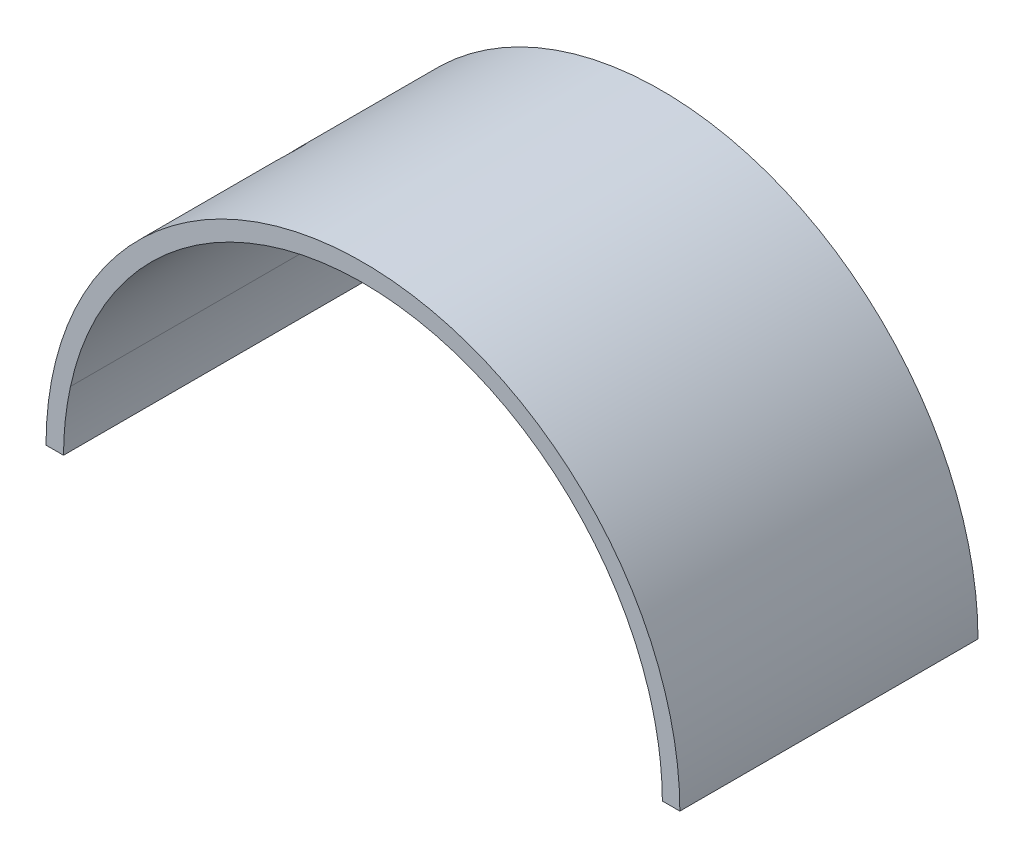
ISO-10303-21;
HEADER;
FILE_DESCRIPTION(('STEP AP214'),'2;1');
FILE_NAME('part.step','',(''),(''),'','','');
FILE_SCHEMA(('AUTOMOTIVE_DESIGN { 1 0 10303 214 1 1 1 1 }'));
ENDSEC;
DATA;
#1=APPLICATION_CONTEXT('core data for automotive mechanical design processes');
#2=APPLICATION_PROTOCOL_DEFINITION('international standard','automotive_design',2000,#1);
#3=PRODUCT_CONTEXT('',#1,'mechanical');
#4=PRODUCT('Part','Part','',(#3));
#5=PRODUCT_RELATED_PRODUCT_CATEGORY('part','',(#4));
#6=PRODUCT_DEFINITION_FORMATION('','',#4);
#7=PRODUCT_DEFINITION_CONTEXT('part definition',#1,'design');
#8=PRODUCT_DEFINITION('design','',#6,#7);
#9=PRODUCT_DEFINITION_SHAPE('','',#8);
#10=(LENGTH_UNIT() NAMED_UNIT(*) SI_UNIT(.MILLI.,.METRE.));
#11=(NAMED_UNIT(*) PLANE_ANGLE_UNIT() SI_UNIT($,.RADIAN.));
#12=(NAMED_UNIT(*) SI_UNIT($,.STERADIAN.) SOLID_ANGLE_UNIT());
#13=UNCERTAINTY_MEASURE_WITH_UNIT(LENGTH_MEASURE(1.E-05),#10,'distance_accuracy_value','');
#14=(GEOMETRIC_REPRESENTATION_CONTEXT(3) GLOBAL_UNCERTAINTY_ASSIGNED_CONTEXT((#13)) GLOBAL_UNIT_ASSIGNED_CONTEXT((#10,
#11,#12)) REPRESENTATION_CONTEXT('',''));
#15=CARTESIAN_POINT('',(0.,0.,0.));
#16=DIRECTION('',(0.,0.,1.));
#17=DIRECTION('',(1.,0.,0.));
#18=AXIS2_PLACEMENT_3D('',#15,#16,#17);
#19=CARTESIAN_POINT('',(0.,0.,15.));
#20=DIRECTION('',(0.,0.,-1.));
#21=DIRECTION('',(-1.,0.,0.));
#22=AXIS2_PLACEMENT_3D('',#19,#20,#21);
#23=CYLINDRICAL_SURFACE('',#22,31.891178343949);
#24=CARTESIAN_POINT('',(-23.5861707782628,21.4648504347034,0.));
#25=CARTESIAN_POINT('',(-23.5861684844341,21.4648533996071,-0.0842056450766564));
#26=CARTESIAN_POINT('',(-23.5813787582294,21.4701196999326,-0.168471160939301));
#27=CARTESIAN_POINT('',(-23.5623197278144,21.4910338898944,-0.334678044970872));
#28=CARTESIAN_POINT('',(-23.5480392265585,21.5066940419807,-0.416616548567354));
#29=CARTESIAN_POINT('',(-23.5103496231131,21.5478883336469,-0.57573765441283));
#30=CARTESIAN_POINT('',(-23.4869451406602,21.5734174762157,-0.652922640639572));
#31=CARTESIAN_POINT('',(-23.4315894525111,21.6335279874064,-0.800367786812534));
#32=CARTESIAN_POINT('',(-23.3996402765991,21.6681072061494,-0.870629585938251));
#33=CARTESIAN_POINT('',(-23.3279586868115,21.7452607784415,-1.00231902878046));
#34=CARTESIAN_POINT('',(-23.288220098308,21.7878414736063,-1.06373959666824));
#35=CARTESIAN_POINT('',(-23.2019794991747,21.8796563486256,-1.1759428236805));
#36=CARTESIAN_POINT('',(-23.1554772138223,21.9288907987314,-1.22672505050055));
#37=CARTESIAN_POINT('',(-23.0568892622577,22.0325264820708,-1.31622871656887));
#38=CARTESIAN_POINT('',(-23.0048011176285,22.086930007566,-1.35494477211088));
#39=CARTESIAN_POINT('',(-22.8964384243817,22.1992442816038,-1.41918249867796));
#40=CARTESIAN_POINT('',(-22.8401639047671,22.2571550058482,-1.44470426110272));
#41=CARTESIAN_POINT('',(-22.7250015758546,22.3747250732506,-1.48181059169306));
#42=CARTESIAN_POINT('',(-22.6661157505129,22.434383077585,-1.49340555890213));
#43=CARTESIAN_POINT('',(-22.5473331559386,22.5537605009847,-1.50236124687815));
#44=CARTESIAN_POINT('',(-22.48743639396,22.6134799196064,-1.49972206973864));
#45=CARTESIAN_POINT('',(-22.3683897133732,22.7312429143901,-1.4802930308368));
#46=CARTESIAN_POINT('',(-22.3092392414373,22.7892877789017,-1.46351436502192));
#47=CARTESIAN_POINT('',(-22.1933607715533,22.9021514274409,-1.41629998423326));
#48=CARTESIAN_POINT('',(-22.1366327829011,22.9569701990895,-1.38586421685857));
#49=CARTESIAN_POINT('',(-22.0272638892622,23.0619308677445,-1.31218681102004));
#50=CARTESIAN_POINT('',(-21.9746246246733,23.1120708892421,-1.26894006594031));
#51=CARTESIAN_POINT('',(-21.8750519089046,23.2063368183472,-1.17087205699757));
#52=CARTESIAN_POINT('',(-21.828118493124,23.2504626886432,-1.11605072133144));
#53=CARTESIAN_POINT('',(-21.741360230017,23.3316105635845,-0.996326401297222));
#54=CARTESIAN_POINT('',(-21.701542311647,23.3686256464621,-0.931413703879964));
#55=CARTESIAN_POINT('',(-21.6303182494101,23.4345674602743,-0.793383437425425));
#56=CARTESIAN_POINT('',(-21.5989121075929,23.4634941892381,-0.720265866388825));
#57=CARTESIAN_POINT('',(-21.5455084446403,23.5125422535556,-0.567895549585973));
#58=CARTESIAN_POINT('',(-21.5235111859085,23.5326633433298,-0.488642632784224));
#59=CARTESIAN_POINT('',(-21.4896337894364,23.5636038548522,-0.326253959852264));
#60=CARTESIAN_POINT('',(-21.4777535843533,23.5744233385153,-0.243118229571348));
#61=CARTESIAN_POINT('',(-21.4645013365074,23.5864902125467,-0.0754091434874953));
#62=CARTESIAN_POINT('',(-21.4631192367628,23.5877467640216,0.00916275860891193));
#63=CARTESIAN_POINT('',(-21.470881490352,23.5806813021931,0.17741847020004));
#64=CARTESIAN_POINT('',(-21.4800258129493,23.5723593168588,0.26110228228722));
#65=CARTESIAN_POINT('',(-21.5085382887741,23.5463458981393,0.425168213638861));
#66=CARTESIAN_POINT('',(-21.5279018578722,23.5286586657864,0.505551795902393));
#67=CARTESIAN_POINT('',(-21.576227877518,23.4843504319728,0.660780517473767));
#68=CARTESIAN_POINT('',(-21.6051903771289,23.4577293848486,0.735625628470407));
#69=CARTESIAN_POINT('',(-21.6718191682856,23.3961868811122,0.877715364740085));
#70=CARTESIAN_POINT('',(-21.7094920705777,23.3612591195535,0.944954159195234));
#71=CARTESIAN_POINT('',(-21.792346545008,23.2839878165644,1.06986396292068));
#72=CARTESIAN_POINT('',(-21.8375281599497,23.24164423286,1.12753491764585));
#73=CARTESIAN_POINT('',(-21.934040418867,23.1505836593391,1.23171758809203));
#74=CARTESIAN_POINT('',(-21.9853758507697,23.1018617041329,1.27822052903582));
#75=CARTESIAN_POINT('',(-22.0926023872006,22.9993406567356,1.3586871436488));
#76=CARTESIAN_POINT('',(-22.148493473608,22.9455415847394,1.39265086719175));
#77=CARTESIAN_POINT('',(-22.2631330170617,22.83432797734,1.44705958460348));
#78=CARTESIAN_POINT('',(-22.3218802740224,22.7769149574821,1.46751020450268));
#79=CARTESIAN_POINT('',(-22.4405279602972,22.6600285326636,1.4943306241586));
#80=CARTESIAN_POINT('',(-22.5004283840926,22.6005551375623,1.5007004912835));
#81=CARTESIAN_POINT('',(-22.6196024256204,22.4812798339522,1.49917793050085));
#82=CARTESIAN_POINT('',(-22.6788765929662,22.4214782982985,1.49129927444848));
#83=CARTESIAN_POINT('',(-22.7951963204169,22.3032097087843,1.46153176221857));
#84=CARTESIAN_POINT('',(-22.852241876277,22.2447426574657,1.43964287935749));
#85=CARTESIAN_POINT('',(-22.9625470713407,22.1308603057349,1.38247899099652));
#86=CARTESIAN_POINT('',(-23.0158066742463,22.0754450345829,1.3472038571758));
#87=CARTESIAN_POINT('',(-23.1171214033634,21.9693273186902,1.26427136489092));
#88=CARTESIAN_POINT('',(-23.1651766943647,21.9186247247342,1.21661439864857));
#89=CARTESIAN_POINT('',(-23.2548770356784,21.8234332558814,1.11022237879009));
#90=CARTESIAN_POINT('',(-23.2965165530456,21.7789497473346,1.05147785935329));
#91=CARTESIAN_POINT('',(-23.3722866367452,21.6976167396833,0.924581961757363));
#92=CARTESIAN_POINT('',(-23.4064153509822,21.6607691236505,0.856428270109561));
#93=CARTESIAN_POINT('',(-23.4663236643244,21.5958530500546,0.712599934019658));
#94=CARTESIAN_POINT('',(-23.4920956951955,21.5677925513314,0.636918552714936));
#95=CARTESIAN_POINT('',(-23.5345880480082,21.5214177084887,0.480288371734971));
#96=CARTESIAN_POINT('',(-23.5513190802707,21.5030918327928,0.39934593248389));
#97=CARTESIAN_POINT('',(-23.5709269704012,21.4815915520604,0.264915879462323));
#98=CARTESIAN_POINT('',(-23.5766369964807,21.4753225045649,0.212299340822071));
#99=CARTESIAN_POINT('',(-23.5842596241817,21.4669510100934,0.106463180096453));
#100=CARTESIAN_POINT('',(-23.5861722286597,21.4648485599832,0.0532435584647787));
#101=CARTESIAN_POINT('',(-23.5861707782628,21.4648504347034,0.));
#102=B_SPLINE_CURVE_WITH_KNOTS('',3,(#24,#25,#26,#27,#28,#29,#30,#31,#32,#33,#34,#35,#36,#37,
#38,#39,#40,#41,#42,#43,#44,#45,#46,#47,#48,#49,#50,#51,#52,#53,#54,#55,#56,#57,#58,#59,#60,#61,
#62,#63,#64,#65,#66,#67,#68,#69,#70,#71,#72,#73,#74,#75,#76,#77,#78,#79,#80,#81,#82,#83,#84,#85,
#86,#87,#88,#89,#90,#91,#92,#93,#94,#95,#96,#97,#98,#99,#100,#101),.UNSPECIFIED.,.T.,.F.,(4,2,2,
2,2,2,2,2,2,2,2,2,2,2,2,2,2,2,2,2,2,2,2,2,2,2,2,2,2,2,2,2,2,2,2,2,2,2,4),(0.,0.252422578213682,
0.505143489953849,0.757736607609463,1.01026977521504,1.26300394008331,1.51574837317983,
1.76860541533365,2.02146070586911,2.27412707346566,2.52679162883007,2.77925630681321,
3.03172195348573,3.2842883718505,3.5368563570604,3.78966896434948,4.04248163324273,
4.29530135235347,4.54811938859166,4.8006951994567,5.05327027281446,5.30573214272693,
5.55819530306864,5.8108507025436,6.06350754232774,6.31636225139883,6.56921595474898,
6.82196431882982,7.07471147365476,7.32721446723857,7.57971794173497,7.83222383679539,
8.08472173415094,8.33743618067422,8.59021287462015,8.84321786061515,9.09592246625197,
9.25553036900808,9.41513815170146),.UNSPECIFIED.);
#103=CARTESIAN_POINT('',(-23.5861707782628,21.4648504347034,0.));
#104=VERTEX_POINT('',#103);
#105=EDGE_CURVE('E172',#104,#104,#102,.T.);
#106=ORIENTED_EDGE('',*,*,#105,.T.);
#107=EDGE_LOOP('',(#106));
#108=FACE_BOUND('',#107,.T.);
#109=CARTESIAN_POINT('',(0.,0.,-15.));
#110=DIRECTION('',(0.,0.,1.));
#111=DIRECTION('',(-1.,0.,0.));
#112=AXIS2_PLACEMENT_3D('',#109,#110,#111);
#113=CIRCLE('',#112,31.891178343949);
#114=CARTESIAN_POINT('',(31.891178343949,0.,-15.));
#115=VERTEX_POINT('',#114);
#116=CARTESIAN_POINT('',(-31.891178343949,0.,-15.));
#117=VERTEX_POINT('',#116);
#118=EDGE_CURVE('E141',#115,#117,#113,.T.);
#119=ORIENTED_EDGE('',*,*,#118,.T.);
#120=DIRECTION('',(0.,0.,-1.));
#121=VECTOR('',#120,1.);
#122=CARTESIAN_POINT('',(-31.891178343949,0.,15.));
#123=LINE('',#122,#121);
#124=CARTESIAN_POINT('',(-31.891178343949,0.,15.));
#125=VERTEX_POINT('',#124);
#126=EDGE_CURVE('E11',#125,#117,#123,.T.);
#127=ORIENTED_EDGE('',*,*,#126,.F.);
#128=CARTESIAN_POINT('',(0.,0.,15.));
#129=DIRECTION('',(0.,0.,1.));
#130=DIRECTION('',(-1.,0.,0.));
#131=AXIS2_PLACEMENT_3D('',#128,#129,#130);
#132=CIRCLE('',#131,31.891178343949);
#133=CARTESIAN_POINT('',(31.891178343949,0.,15.));
#134=VERTEX_POINT('',#133);
#135=EDGE_CURVE('E147',#134,#125,#132,.T.);
#136=ORIENTED_EDGE('',*,*,#135,.F.);
#137=DIRECTION('',(0.,0.,-1.));
#138=VECTOR('',#137,1.);
#139=CARTESIAN_POINT('',(31.891178343949,0.,15.));
#140=LINE('',#139,#138);
#141=EDGE_CURVE('E63',#134,#115,#140,.T.);
#142=ORIENTED_EDGE('',*,*,#141,.T.);
#143=EDGE_LOOP('',(#119,#127,#136,#142));
#144=FACE_BOUND('',#143,.T.);
#145=ADVANCED_FACE('F47',(#108,#144),#23,.T.);
#146=CARTESIAN_POINT('',(-31.891178343949,0.,15.));
#147=DIRECTION('',(0.,1.,0.));
#148=DIRECTION('',(0.,0.,1.));
#149=AXIS2_PLACEMENT_3D('',#146,#147,#148);
#150=PLANE('',#149);
#151=DIRECTION('',(1.,0.,0.));
#152=VECTOR('',#151,1.);
#153=CARTESIAN_POINT('',(-31.891178343949,0.,-15.));
#154=LINE('',#153,#152);
#155=CARTESIAN_POINT('',(-30.129278343949,0.,-15.));
#156=VERTEX_POINT('',#155);
#157=EDGE_CURVE('E83',#117,#156,#154,.T.);
#158=ORIENTED_EDGE('',*,*,#157,.T.);
#159=DIRECTION('',(0.,0.,-1.));
#160=VECTOR('',#159,1.);
#161=CARTESIAN_POINT('',(-30.129278343949,0.,15.));
#162=LINE('',#161,#160);
#163=CARTESIAN_POINT('',(-30.129278343949,0.,15.));
#164=VERTEX_POINT('',#163);
#165=EDGE_CURVE('E137',#164,#156,#162,.T.);
#166=ORIENTED_EDGE('',*,*,#165,.F.);
#167=DIRECTION('',(1.,0.,0.));
#168=VECTOR('',#167,1.);
#169=CARTESIAN_POINT('',(-31.891178343949,0.,15.));
#170=LINE('',#169,#168);
#171=EDGE_CURVE('E124',#125,#164,#170,.T.);
#172=ORIENTED_EDGE('',*,*,#171,.F.);
#173=ORIENTED_EDGE('',*,*,#126,.T.);
#174=EDGE_LOOP('',(#158,#166,#172,#173));
#175=FACE_BOUND('',#174,.T.);
#176=ADVANCED_FACE('F199',(#175),#150,.F.);
#177=CARTESIAN_POINT('',(30.472178343949,0.,15.));
#178=DIRECTION('',(0.,1.,0.));
#179=DIRECTION('',(0.,0.,1.));
#180=AXIS2_PLACEMENT_3D('',#177,#178,#179);
#181=PLANE('',#180);
#182=DIRECTION('',(1.,0.,0.));
#183=VECTOR('',#182,1.);
#184=CARTESIAN_POINT('',(30.472178343949,0.,-15.));
#185=LINE('',#184,#183);
#186=CARTESIAN_POINT('',(30.129278343949,0.,-15.));
#187=VERTEX_POINT('',#186);
#188=EDGE_CURVE('E150',#187,#115,#185,.T.);
#189=ORIENTED_EDGE('',*,*,#188,.T.);
#190=ORIENTED_EDGE('',*,*,#141,.F.);
#191=DIRECTION('',(1.,0.,0.));
#192=VECTOR('',#191,1.);
#193=CARTESIAN_POINT('',(30.472178343949,0.,15.));
#194=LINE('',#193,#192);
#195=CARTESIAN_POINT('',(30.129278343949,0.,15.));
#196=VERTEX_POINT('',#195);
#197=EDGE_CURVE('E71',#196,#134,#194,.T.);
#198=ORIENTED_EDGE('',*,*,#197,.F.);
#199=DIRECTION('',(0.,0.,-1.));
#200=VECTOR('',#199,1.);
#201=CARTESIAN_POINT('',(30.129278343949,0.,15.));
#202=LINE('',#201,#200);
#203=EDGE_CURVE('E120',#196,#187,#202,.T.);
#204=ORIENTED_EDGE('',*,*,#203,.T.);
#205=EDGE_LOOP('',(#189,#190,#198,#204));
#206=FACE_BOUND('',#205,.T.);
#207=ADVANCED_FACE('F119',(#206),#181,.F.);
#208=CARTESIAN_POINT('',(0.,0.,15.));
#209=DIRECTION('',(0.,0.,-1.));
#210=DIRECTION('',(-1.,0.,0.));
#211=AXIS2_PLACEMENT_3D('',#208,#209,#210);
#212=PLANE('',#211);
#213=ORIENTED_EDGE('',*,*,#135,.T.);
#214=ORIENTED_EDGE('',*,*,#171,.T.);
#215=CARTESIAN_POINT('',(0.,-0.116742127165869,15.));
#216=DIRECTION('',(0.,0.,-1.));
#217=DIRECTION('',(-1.,0.,0.));
#218=AXIS2_PLACEMENT_3D('',#215,#216,#217);
#219=CIRCLE('',#218,30.1295045138716);
#220=CARTESIAN_POINT('',(-29.4273391340799,6.35,15.));
#221=VERTEX_POINT('',#220);
#222=EDGE_CURVE('E91',#164,#221,#219,.T.);
#223=ORIENTED_EDGE('',*,*,#222,.T.);
#224=CARTESIAN_POINT('',(0.,0.,15.));
#225=DIRECTION('',(0.,0.,-1.));
#226=DIRECTION('',(1.,0.,0.));
#227=AXIS2_PLACEMENT_3D('',#224,#225,#226);
#228=ELLIPSE('',#227,30.1052922759765,30.091178343949);
#229=CARTESIAN_POINT('',(29.4273391340799,6.35,15.));
#230=VERTEX_POINT('',#229);
#231=EDGE_CURVE('E128',#221,#230,#228,.T.);
#232=ORIENTED_EDGE('',*,*,#231,.T.);
#233=CARTESIAN_POINT('',(0.,-0.116742127165869,15.));
#234=DIRECTION('',(0.,0.,-1.));
#235=DIRECTION('',(-1.,0.,0.));
#236=AXIS2_PLACEMENT_3D('',#233,#234,#235);
#237=CIRCLE('',#236,30.1295045138716);
#238=EDGE_CURVE('E116',#230,#196,#237,.T.);
#239=ORIENTED_EDGE('',*,*,#238,.T.);
#240=ORIENTED_EDGE('',*,*,#197,.T.);
#241=EDGE_LOOP('',(#213,#214,#223,#232,#239,#240));
#242=FACE_BOUND('',#241,.T.);
#243=ADVANCED_FACE('F126',(#242),#212,.F.);
#244=CARTESIAN_POINT('',(0.,0.,-15.));
#245=DIRECTION('',(0.,0.,-1.));
#246=DIRECTION('',(-1.,0.,0.));
#247=AXIS2_PLACEMENT_3D('',#244,#245,#246);
#248=PLANE('',#247);
#249=ORIENTED_EDGE('',*,*,#118,.F.);
#250=ORIENTED_EDGE('',*,*,#188,.F.);
#251=CARTESIAN_POINT('',(0.,-0.116742127165869,-15.));
#252=DIRECTION('',(0.,0.,-1.));
#253=DIRECTION('',(-1.,0.,0.));
#254=AXIS2_PLACEMENT_3D('',#251,#252,#253);
#255=CIRCLE('',#254,30.1295045138716);
#256=CARTESIAN_POINT('',(29.4273391340799,6.35,-15.));
#257=VERTEX_POINT('',#256);
#258=EDGE_CURVE('E134',#257,#187,#255,.T.);
#259=ORIENTED_EDGE('',*,*,#258,.F.);
#260=CARTESIAN_POINT('',(0.,0.,-15.));
#261=DIRECTION('',(0.,0.,-1.));
#262=DIRECTION('',(1.,0.,0.));
#263=AXIS2_PLACEMENT_3D('',#260,#261,#262);
#264=ELLIPSE('',#263,30.1052922759765,30.091178343949);
#265=CARTESIAN_POINT('',(-29.4273391340799,6.35,-15.));
#266=VERTEX_POINT('',#265);
#267=EDGE_CURVE('E166',#266,#257,#264,.T.);
#268=ORIENTED_EDGE('',*,*,#267,.F.);
#269=CARTESIAN_POINT('',(0.,-0.116742127165869,-15.));
#270=DIRECTION('',(0.,0.,-1.));
#271=DIRECTION('',(-1.,0.,0.));
#272=AXIS2_PLACEMENT_3D('',#269,#270,#271);
#273=CIRCLE('',#272,30.1295045138716);
#274=EDGE_CURVE('E109',#156,#266,#273,.T.);
#275=ORIENTED_EDGE('',*,*,#274,.F.);
#276=ORIENTED_EDGE('',*,*,#157,.F.);
#277=EDGE_LOOP('',(#249,#250,#259,#268,#275,#276));
#278=FACE_BOUND('',#277,.T.);
#279=ADVANCED_FACE('F163',(#278),#248,.T.);
#280=DIRECTION('',(0.,0.,-1.));
#281=VECTOR('',#280,1.);
#282=SURFACE_OF_LINEAR_EXTRUSION('',#228,#281);
#283=CARTESIAN_POINT('',(-22.3173756934258,20.1960553498664,0.));
#284=CARTESIAN_POINT('',(-22.3173720699418,20.1960598988503,0.0842118870157788));
#285=CARTESIAN_POINT('',(-22.3125885295493,20.2013446421752,0.16851012024988));
#286=CARTESIAN_POINT('',(-22.2983425726377,20.2170490014014,0.293078415454844));
#287=CARTESIAN_POINT('',(-22.2924077724488,20.223588481611,0.334320760957655));
#288=CARTESIAN_POINT('',(-22.2782108787267,20.2392120671441,0.415955999808417));
#289=CARTESIAN_POINT('',(-22.2699467377907,20.2482984110258,0.456348112116058));
#290=CARTESIAN_POINT('',(-22.2417544986396,20.2792479485778,0.575646484153211));
#291=CARTESIAN_POINT('',(-22.2184075535403,20.3048227593725,0.652840638303673));
#292=CARTESIAN_POINT('',(-22.1631610892486,20.3650540056566,0.800318576057142));
#293=CARTESIAN_POINT('',(-22.1312613414147,20.3997106839304,0.870602174852092));
#294=CARTESIAN_POINT('',(-22.0776151317216,20.4576522151797,0.969352859419526));
#295=CARTESIAN_POINT('',(-22.0587440879092,20.4779833048965,1.00118721594349));
#296=CARTESIAN_POINT('',(-22.0192029581346,20.5204546897901,1.06238056876157));
#297=CARTESIAN_POINT('',(-21.9985346195137,20.5425932265029,1.09174191583743));
#298=CARTESIAN_POINT('',(-21.9339761128854,20.6115172796569,1.17585770206296));
#299=CARTESIAN_POINT('',(-21.8875191834862,20.6608256199224,1.22666830756315));
#300=CARTESIAN_POINT('',(-21.789025140384,20.7645746710846,1.31619922390322));
#301=CARTESIAN_POINT('',(-21.7369853439132,20.8190178479219,1.35491368683736));
#302=CARTESIAN_POINT('',(-21.62869047376,20.9313966281349,1.41915649958636));
#303=CARTESIAN_POINT('',(-21.5724354320795,20.9893322049958,1.44468494949702));
#304=CARTESIAN_POINT('',(-21.4572912533229,21.1069189508684,1.48179958323733));
#305=CARTESIAN_POINT('',(-21.3984043738336,21.1665686344131,1.49339748731581));
#306=CARTESIAN_POINT('',(-21.2795904348727,21.2859017243343,1.50236107459207));
#307=CARTESIAN_POINT('',(-21.2196633834559,21.3455851304462,1.49972686794961));
#308=CARTESIAN_POINT('',(-21.1005337915442,21.4632443632428,1.48030991597405));
#309=CARTESIAN_POINT('',(-21.0413306652442,21.5212216325176,1.46353950101837));
#310=CARTESIAN_POINT('',(-20.9253234522278,21.6339284608625,1.41634568030843));
#311=CARTESIAN_POINT('',(-20.8685193758838,21.6886580058911,1.3859222155303));
#312=CARTESIAN_POINT('',(-20.7589772918816,21.7934300453406,1.31227077271103));
#313=CARTESIAN_POINT('',(-20.7062412018965,21.8434703315759,1.26903680165181));
#314=CARTESIAN_POINT('',(-20.6064663692459,21.9375321525425,1.17099600781837));
#315=CARTESIAN_POINT('',(-20.5594276669006,21.9815536446793,1.11618910315057));
#316=CARTESIAN_POINT('',(-20.4724541161481,22.0625036777707,0.996486751836818));
#317=CARTESIAN_POINT('',(-20.4325270860122,22.0994244159694,0.931580347258977));
#318=CARTESIAN_POINT('',(-20.3610974229768,22.1651916111584,0.793559919648567));
#319=CARTESIAN_POINT('',(-20.3295947915238,22.1940380667622,0.720445895206602));
#320=CARTESIAN_POINT('',(-20.2760203499443,22.2429477165631,0.56808020168031));
#321=CARTESIAN_POINT('',(-20.2539486985494,22.2630107629279,0.488828429318919));
#322=CARTESIAN_POINT('',(-20.2199516399826,22.2938637558685,0.326438963412227));
#323=CARTESIAN_POINT('',(-20.2080261554243,22.304653773171,0.243301299510307));
#324=CARTESIAN_POINT('',(-20.1947178228173,22.3166926853974,0.0755976891646732));
#325=CARTESIAN_POINT('',(-20.1933234228143,22.3179520348828,-0.00896659024621945));
#326=CARTESIAN_POINT('',(-20.2010923396587,22.3109267902174,-0.177208826028274));
#327=CARTESIAN_POINT('',(-20.2102556212013,22.3026422279814,-0.260886785362342));
#328=CARTESIAN_POINT('',(-20.2388335001911,22.276736217601,-0.424937573355346));
#329=CARTESIAN_POINT('',(-20.2582428521298,22.2591195470433,-0.505312070558634));
#330=CARTESIAN_POINT('',(-20.3066817741522,22.2149794368159,-0.660525791681849));
#331=CARTESIAN_POINT('',(-20.3357114003644,22.1884559451802,-0.735364983303507));
#332=CARTESIAN_POINT('',(-20.4024916871832,22.1271237752897,-0.877454975172304));
#333=CARTESIAN_POINT('',(-20.4402498954967,22.0923079257416,-0.944699132558702));
#334=CARTESIAN_POINT('',(-20.5232814720315,22.0152668464,-1.06962346696603));
#335=CARTESIAN_POINT('',(-20.568554889056,21.9730415684902,-1.12730358187414));
#336=CARTESIAN_POINT('',(-20.6652540168951,21.8822076411448,-1.23151505734047));
#337=CARTESIAN_POINT('',(-20.7166852379657,21.8335932706299,-1.27803631901681));
#338=CARTESIAN_POINT('',(-20.8240932763874,21.7312712383962,-1.35854061767316));
#339=CARTESIAN_POINT('',(-20.8800700743283,21.6775635984259,-1.39252370818897));
#340=CARTESIAN_POINT('',(-20.9948611796159,21.5665106887715,-1.446969852099));
#341=CARTESIAN_POINT('',(-21.0536741785873,21.5091670926279,-1.46743907678539));
#342=CARTESIAN_POINT('',(-21.1724295318662,21.392390916188,-1.49429702648369));
#343=CARTESIAN_POINT('',(-21.2323718797787,21.3329583477189,-1.50068583120206));
#344=CARTESIAN_POINT('',(-21.3515976117058,21.2137396173807,-1.49919840463336));
#345=CARTESIAN_POINT('',(-21.4108816457872,21.1539539143001,-1.49133779599439));
#346=CARTESIAN_POINT('',(-21.5271893353718,21.035694271918,-1.46161524461105));
#347=CARTESIAN_POINT('',(-21.5842129868881,20.9772203349302,-1.43975327717201));
#348=CARTESIAN_POINT('',(-21.6944769684534,20.8632729536093,-1.38262075439723));
#349=CARTESIAN_POINT('',(-21.7477173530384,20.8077994660271,-1.34735039239101));
#350=CARTESIAN_POINT('',(-21.8236049357587,20.7281716961824,-1.2852208348143));
#351=CARTESIAN_POINT('',(-21.848242880976,20.7022216502845,-1.26296860511254));
#352=CARTESIAN_POINT('',(-21.8960845858954,20.6516618751931,-1.21551659401488));
#353=CARTESIAN_POINT('',(-21.9192869434207,20.6270534591077,-1.1903139982769));
#354=CARTESIAN_POINT('',(-21.986488444154,20.5555531014322,-1.11054260183842));
#355=CARTESIAN_POINT('',(-22.0280959550328,20.5109713895092,-1.05179874129597));
#356=CARTESIAN_POINT('',(-22.1037802685721,20.4294645416136,-0.924904177645624));
#357=CARTESIAN_POINT('',(-22.1378572107601,20.3925392637823,-0.856753648863943));
#358=CARTESIAN_POINT('',(-22.1827061846352,20.3437539737468,-0.748943190795513));
#359=CARTESIAN_POINT('',(-22.1966244941932,20.3285782702594,-0.712027432174437));
#360=CARTESIAN_POINT('',(-22.2222730684752,20.3005634617856,-0.636629444550847));
#361=CARTESIAN_POINT('',(-22.2340052547781,20.2877223050018,-0.598148627816516));
#362=CARTESIAN_POINT('',(-22.265805110502,20.2528685340336,-0.480759796580182));
#363=CARTESIAN_POINT('',(-22.2825253965453,20.2344717946461,-0.399786408090455));
#364=CARTESIAN_POINT('',(-22.3021289195734,20.2128779591588,-0.265272274109987));
#365=CARTESIAN_POINT('',(-22.3078391856412,20.2065794882902,-0.212587917443622));
#366=CARTESIAN_POINT('',(-22.315463718212,20.1981667451404,-0.106613914027728));
#367=CARTESIAN_POINT('',(-22.3173779878719,20.1960524693796,-0.053324267781592));
#368=CARTESIAN_POINT('',(-22.3173756934258,20.1960553498664,0.));
#369=B_SPLINE_CURVE_WITH_KNOTS('',3,(#283,#284,#285,#286,#287,#288,#289,#290,#291,#292,#293,
#294,#295,#296,#297,#298,#299,#300,#301,#302,#303,#304,#305,#306,#307,#308,#309,#310,#311,#312,
#313,#314,#315,#316,#317,#318,#319,#320,#321,#322,#323,#324,#325,#326,#327,#328,#329,#330,#331,
#332,#333,#334,#335,#336,#337,#338,#339,#340,#341,#342,#343,#344,#345,#346,#347,#348,#349,#350,
#351,#352,#353,#354,#355,#356,#357,#358,#359,#360,#361,#362,#363,#364,#365,#366,#367,#368),
.UNSPECIFIED.,.T.,.F.,(4,2,2,2,2,2,2,2,2,2,2,2,2,2,2,2,2,2,2,2,2,2,2,2,2,2,2,2,2,2,2,2,2,2,2,2,
2,2,2,2,2,2,4),(0.,0.252407657302974,0.378817148517887,0.505338097278104,0.757881676475968,
1.01043200757711,1.13697325157148,1.26339281813009,1.51613926090552,1.76900770608953,
2.02187423170613,2.27452786263714,2.52717953797476,2.77961106441443,3.03204368215827,
3.28459458002153,3.53714726507115,3.78997590484157,4.04280458802728,4.29563752636975,
4.54846853630024,4.80102216577089,5.0535749507058,5.30599856564866,5.55842365335626,
5.81106783790913,6.06371366317281,6.31658728014995,6.56945981738842,6.82221679689101,
7.07497234558302,7.32745094792246,7.5799299955683,7.83240540297192,7.95869050746686,
8.08509707173572,8.3378413576934,8.59058096037315,8.71725832395759,8.843823808758,
9.09654112961037,9.25636969037448,9.41619811822606),.UNSPECIFIED.);
#370=CARTESIAN_POINT('',(-22.3173756934258,20.1960553498664,0.));
#371=VERTEX_POINT('',#370);
#372=EDGE_CURVE('E51',#371,#371,#369,.T.);
#373=ORIENTED_EDGE('',*,*,#372,.T.);
#374=EDGE_LOOP('',(#373));
#375=FACE_BOUND('',#374,.T.);
#376=ORIENTED_EDGE('',*,*,#267,.T.);
#377=DIRECTION('',(0.,0.,-1.));
#378=VECTOR('',#377,1.);
#379=CARTESIAN_POINT('',(29.4273391340799,6.35,15.));
#380=LINE('',#379,#378);
#381=EDGE_CURVE('E136',#230,#257,#380,.T.);
#382=ORIENTED_EDGE('',*,*,#381,.F.);
#383=ORIENTED_EDGE('',*,*,#231,.F.);
#384=DIRECTION('',(0.,0.,-1.));
#385=VECTOR('',#384,1.);
#386=CARTESIAN_POINT('',(-29.4273391340799,6.35,15.));
#387=LINE('',#386,#385);
#388=EDGE_CURVE('E143',#221,#266,#387,.T.);
#389=ORIENTED_EDGE('',*,*,#388,.T.);
#390=EDGE_LOOP('',(#376,#382,#383,#389));
#391=FACE_BOUND('',#390,.T.);
#392=ADVANCED_FACE('F170',(#375,#391),#282,.F.);
#393=CARTESIAN_POINT('',(0.,-0.116742127165869,15.));
#394=DIRECTION('',(0.,0.,-1.));
#395=DIRECTION('',(-1.,0.,0.));
#396=AXIS2_PLACEMENT_3D('',#393,#394,#395);
#397=CYLINDRICAL_SURFACE('',#396,30.1295045138716);
#398=ORIENTED_EDGE('',*,*,#258,.T.);
#399=ORIENTED_EDGE('',*,*,#203,.F.);
#400=ORIENTED_EDGE('',*,*,#238,.F.);
#401=ORIENTED_EDGE('',*,*,#381,.T.);
#402=EDGE_LOOP('',(#398,#399,#400,#401));
#403=FACE_BOUND('',#402,.T.);
#404=ADVANCED_FACE('F133',(#403),#397,.F.);
#405=CARTESIAN_POINT('',(0.,-0.116742127165869,15.));
#406=DIRECTION('',(0.,0.,-1.));
#407=DIRECTION('',(-1.,0.,0.));
#408=AXIS2_PLACEMENT_3D('',#405,#406,#407);
#409=CYLINDRICAL_SURFACE('',#408,30.1295045138716);
#410=ORIENTED_EDGE('',*,*,#274,.T.);
#411=ORIENTED_EDGE('',*,*,#388,.F.);
#412=ORIENTED_EDGE('',*,*,#222,.F.);
#413=ORIENTED_EDGE('',*,*,#165,.T.);
#414=EDGE_LOOP('',(#410,#411,#412,#413));
#415=FACE_BOUND('',#414,.T.);
#416=ADVANCED_FACE('F207',(#415),#409,.F.);
#417=CARTESIAN_POINT('',(-22.5504684670358,22.5504684670361,0.));
#418=DIRECTION('',(-0.707106781186544,0.707106781186551,0.));
#419=DIRECTION('',(-0.707106781186551,-0.707106781186544,0.));
#420=AXIS2_PLACEMENT_3D('',#417,#418,#419);
#421=CYLINDRICAL_SURFACE('',#420,1.49999999999999);
#422=ORIENTED_EDGE('',*,*,#372,.F.);
#423=EDGE_LOOP('',(#422));
#424=FACE_BOUND('',#423,.T.);
#425=ORIENTED_EDGE('',*,*,#105,.F.);
#426=EDGE_LOOP('',(#425));
#427=FACE_BOUND('',#426,.T.);
#428=ADVANCED_FACE('F209',(#424,#427),#421,.F.);
#429=CLOSED_SHELL('',(#145,#176,#207,#243,#279,#392,#404,#416,#428));
#430=MANIFOLD_SOLID_BREP('B2',#429);
#431=ADVANCED_BREP_SHAPE_REPRESENTATION('',(#18,#430),#14);
#432=SHAPE_DEFINITION_REPRESENTATION(#9,#431);
ENDSEC;
END-ISO-10303-21;
